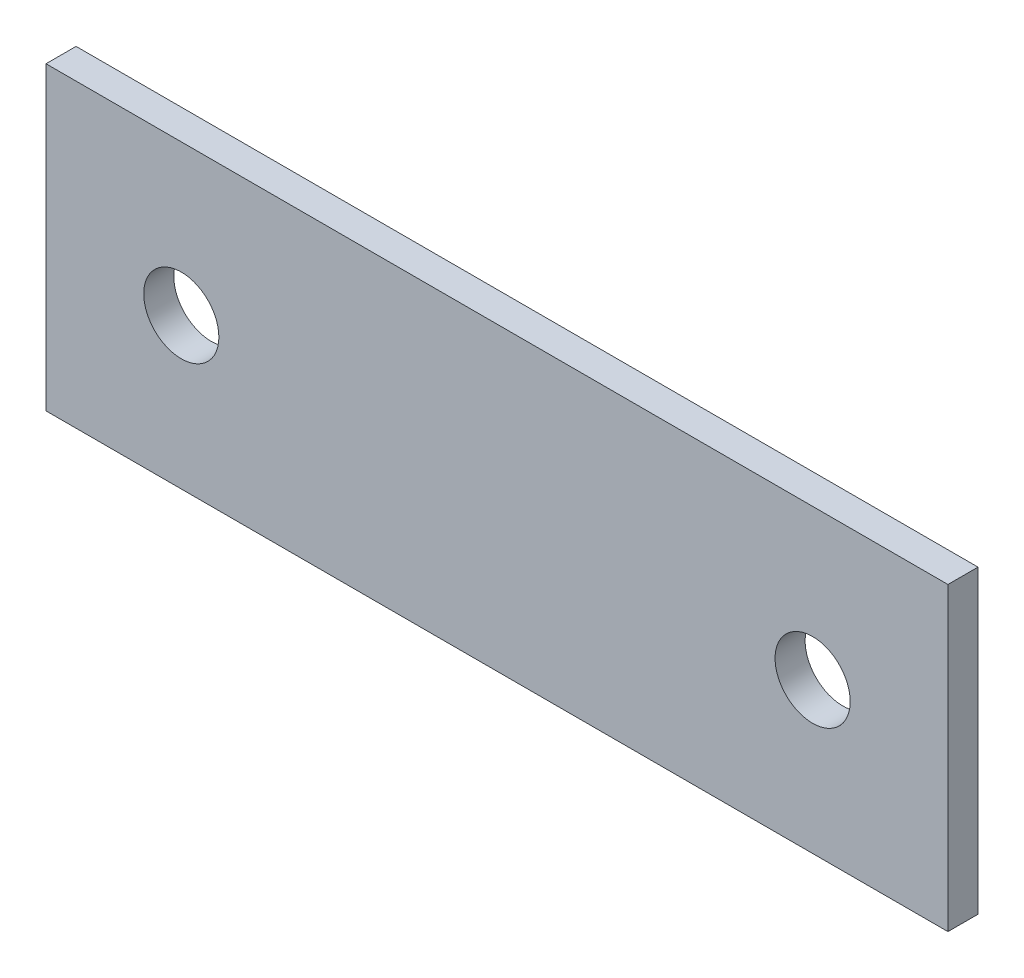
ISO-10303-21;
HEADER;
FILE_DESCRIPTION(('STEP AP214'),'2;1');
FILE_NAME('part.step','',(''),(''),'','','');
FILE_SCHEMA(('AUTOMOTIVE_DESIGN { 1 0 10303 214 1 1 1 1 }'));
ENDSEC;
DATA;
#1=APPLICATION_CONTEXT('core data for automotive mechanical design processes');
#2=APPLICATION_PROTOCOL_DEFINITION('international standard','automotive_design',2000,#1);
#3=PRODUCT_CONTEXT('',#1,'mechanical');
#4=PRODUCT('Part','Part','',(#3));
#5=PRODUCT_RELATED_PRODUCT_CATEGORY('part','',(#4));
#6=PRODUCT_DEFINITION_FORMATION('','',#4);
#7=PRODUCT_DEFINITION_CONTEXT('part definition',#1,'design');
#8=PRODUCT_DEFINITION('design','',#6,#7);
#9=PRODUCT_DEFINITION_SHAPE('','',#8);
#10=(LENGTH_UNIT() NAMED_UNIT(*) SI_UNIT(.MILLI.,.METRE.));
#11=(NAMED_UNIT(*) PLANE_ANGLE_UNIT() SI_UNIT($,.RADIAN.));
#12=(NAMED_UNIT(*) SI_UNIT($,.STERADIAN.) SOLID_ANGLE_UNIT());
#13=UNCERTAINTY_MEASURE_WITH_UNIT(LENGTH_MEASURE(1.E-05),#10,'distance_accuracy_value','');
#14=(GEOMETRIC_REPRESENTATION_CONTEXT(3) GLOBAL_UNCERTAINTY_ASSIGNED_CONTEXT((#13)) GLOBAL_UNIT_ASSIGNED_CONTEXT((#10,
#11,#12)) REPRESENTATION_CONTEXT('',''));
#15=CARTESIAN_POINT('',(0.,0.,0.));
#16=DIRECTION('',(0.,0.,1.));
#17=DIRECTION('',(1.,0.,0.));
#18=AXIS2_PLACEMENT_3D('',#15,#16,#17);
#19=CARTESIAN_POINT('',(0.,0.,2.));
#20=DIRECTION('',(0.,0.,-1.));
#21=DIRECTION('',(-1.,0.,0.));
#22=AXIS2_PLACEMENT_3D('',#19,#20,#21);
#23=PLANE('',#22);
#24=DIRECTION('',(0.,-1.,0.));
#25=VECTOR('',#24,1.);
#26=CARTESIAN_POINT('',(-30.,10.,2.));
#27=LINE('',#26,#25);
#28=CARTESIAN_POINT('',(-30.,10.,2.));
#29=VERTEX_POINT('',#28);
#30=CARTESIAN_POINT('',(-30.,-10.,2.));
#31=VERTEX_POINT('',#30);
#32=EDGE_CURVE('E88',#29,#31,#27,.T.);
#33=ORIENTED_EDGE('',*,*,#32,.T.);
#34=DIRECTION('',(1.,0.,0.));
#35=VECTOR('',#34,1.);
#36=CARTESIAN_POINT('',(30.,-10.,2.));
#37=LINE('',#36,#35);
#38=CARTESIAN_POINT('',(30.,-10.,2.));
#39=VERTEX_POINT('',#38);
#40=EDGE_CURVE('E83',#31,#39,#37,.T.);
#41=ORIENTED_EDGE('',*,*,#40,.T.);
#42=DIRECTION('',(0.,1.,0.));
#43=VECTOR('',#42,1.);
#44=CARTESIAN_POINT('',(30.,10.,2.));
#45=LINE('',#44,#43);
#46=CARTESIAN_POINT('',(30.,10.,2.));
#47=VERTEX_POINT('',#46);
#48=EDGE_CURVE('E86',#39,#47,#45,.T.);
#49=ORIENTED_EDGE('',*,*,#48,.T.);
#50=DIRECTION('',(-1.,0.,0.));
#51=VECTOR('',#50,1.);
#52=CARTESIAN_POINT('',(30.,10.,2.));
#53=LINE('',#52,#51);
#54=EDGE_CURVE('E53',#47,#29,#53,.T.);
#55=ORIENTED_EDGE('',*,*,#54,.T.);
#56=EDGE_LOOP('',(#33,#41,#49,#55));
#57=FACE_BOUND('',#56,.T.);
#58=CARTESIAN_POINT('',(-21.,0.,2.));
#59=DIRECTION('',(0.,0.,1.));
#60=DIRECTION('',(1.,0.,0.));
#61=AXIS2_PLACEMENT_3D('',#58,#59,#60);
#62=CIRCLE('',#61,2.5);
#63=CARTESIAN_POINT('',(-18.5,0.,2.));
#64=VERTEX_POINT('',#63);
#65=EDGE_CURVE('E103',#64,#64,#62,.T.);
#66=ORIENTED_EDGE('',*,*,#65,.F.);
#67=EDGE_LOOP('',(#66));
#68=FACE_BOUND('',#67,.T.);
#69=CARTESIAN_POINT('',(21.,0.,2.));
#70=DIRECTION('',(0.,0.,1.));
#71=DIRECTION('',(1.,0.,0.));
#72=AXIS2_PLACEMENT_3D('',#69,#70,#71);
#73=CIRCLE('',#72,2.5);
#74=CARTESIAN_POINT('',(23.5,0.,2.));
#75=VERTEX_POINT('',#74);
#76=EDGE_CURVE('E118',#75,#75,#73,.T.);
#77=ORIENTED_EDGE('',*,*,#76,.F.);
#78=EDGE_LOOP('',(#77));
#79=FACE_BOUND('',#78,.T.);
#80=ADVANCED_FACE('F36',(#57,#68,#79),#23,.F.);
#81=CARTESIAN_POINT('',(0.,0.,0.));
#82=DIRECTION('',(0.,0.,-1.));
#83=DIRECTION('',(-1.,0.,0.));
#84=AXIS2_PLACEMENT_3D('',#81,#82,#83);
#85=PLANE('',#84);
#86=CARTESIAN_POINT('',(-21.,0.,0.));
#87=DIRECTION('',(0.,0.,1.));
#88=DIRECTION('',(1.,0.,0.));
#89=AXIS2_PLACEMENT_3D('',#86,#87,#88);
#90=CIRCLE('',#89,2.5);
#91=CARTESIAN_POINT('',(-18.5,0.,0.));
#92=VERTEX_POINT('',#91);
#93=EDGE_CURVE('E115',#92,#92,#90,.T.);
#94=ORIENTED_EDGE('',*,*,#93,.T.);
#95=EDGE_LOOP('',(#94));
#96=FACE_BOUND('',#95,.T.);
#97=DIRECTION('',(0.,-1.,0.));
#98=VECTOR('',#97,1.);
#99=CARTESIAN_POINT('',(-30.,10.,0.));
#100=LINE('',#99,#98);
#101=CARTESIAN_POINT('',(-30.,10.,0.));
#102=VERTEX_POINT('',#101);
#103=CARTESIAN_POINT('',(-30.,-10.,0.));
#104=VERTEX_POINT('',#103);
#105=EDGE_CURVE('E100',#102,#104,#100,.T.);
#106=ORIENTED_EDGE('',*,*,#105,.F.);
#107=DIRECTION('',(-1.,0.,0.));
#108=VECTOR('',#107,1.);
#109=CARTESIAN_POINT('',(30.,10.,0.));
#110=LINE('',#109,#108);
#111=CARTESIAN_POINT('',(30.,10.,0.));
#112=VERTEX_POINT('',#111);
#113=EDGE_CURVE('E76',#112,#102,#110,.T.);
#114=ORIENTED_EDGE('',*,*,#113,.F.);
#115=DIRECTION('',(0.,1.,0.));
#116=VECTOR('',#115,1.);
#117=CARTESIAN_POINT('',(30.,10.,0.));
#118=LINE('',#117,#116);
#119=CARTESIAN_POINT('',(30.,-10.,0.));
#120=VERTEX_POINT('',#119);
#121=EDGE_CURVE('E70',#120,#112,#118,.T.);
#122=ORIENTED_EDGE('',*,*,#121,.F.);
#123=DIRECTION('',(1.,0.,0.));
#124=VECTOR('',#123,1.);
#125=CARTESIAN_POINT('',(30.,-10.,0.));
#126=LINE('',#125,#124);
#127=EDGE_CURVE('E92',#104,#120,#126,.T.);
#128=ORIENTED_EDGE('',*,*,#127,.F.);
#129=EDGE_LOOP('',(#106,#114,#122,#128));
#130=FACE_BOUND('',#129,.T.);
#131=CARTESIAN_POINT('',(21.,0.,0.));
#132=DIRECTION('',(0.,0.,1.));
#133=DIRECTION('',(1.,0.,0.));
#134=AXIS2_PLACEMENT_3D('',#131,#132,#133);
#135=CIRCLE('',#134,2.5);
#136=CARTESIAN_POINT('',(23.5,0.,0.));
#137=VERTEX_POINT('',#136);
#138=EDGE_CURVE('E121',#137,#137,#135,.T.);
#139=ORIENTED_EDGE('',*,*,#138,.T.);
#140=EDGE_LOOP('',(#139));
#141=FACE_BOUND('',#140,.T.);
#142=ADVANCED_FACE('F111',(#96,#130,#141),#85,.T.);
#143=CARTESIAN_POINT('',(-30.,10.,2.));
#144=DIRECTION('',(1.,0.,0.));
#145=DIRECTION('',(0.,0.,-1.));
#146=AXIS2_PLACEMENT_3D('',#143,#144,#145);
#147=PLANE('',#146);
#148=ORIENTED_EDGE('',*,*,#105,.T.);
#149=DIRECTION('',(0.,0.,-1.));
#150=VECTOR('',#149,1.);
#151=CARTESIAN_POINT('',(-30.,-10.,2.));
#152=LINE('',#151,#150);
#153=EDGE_CURVE('E11',#31,#104,#152,.T.);
#154=ORIENTED_EDGE('',*,*,#153,.F.);
#155=ORIENTED_EDGE('',*,*,#32,.F.);
#156=DIRECTION('',(0.,0.,-1.));
#157=VECTOR('',#156,1.);
#158=CARTESIAN_POINT('',(-30.,10.,2.));
#159=LINE('',#158,#157);
#160=EDGE_CURVE('E96',#29,#102,#159,.T.);
#161=ORIENTED_EDGE('',*,*,#160,.T.);
#162=EDGE_LOOP('',(#148,#154,#155,#161));
#163=FACE_BOUND('',#162,.T.);
#164=ADVANCED_FACE('F38',(#163),#147,.F.);
#165=CARTESIAN_POINT('',(30.,-10.,2.));
#166=DIRECTION('',(0.,1.,0.));
#167=DIRECTION('',(-1.,0.,0.));
#168=AXIS2_PLACEMENT_3D('',#165,#166,#167);
#169=PLANE('',#168);
#170=ORIENTED_EDGE('',*,*,#127,.T.);
#171=DIRECTION('',(0.,0.,-1.));
#172=VECTOR('',#171,1.);
#173=CARTESIAN_POINT('',(30.,-10.,2.));
#174=LINE('',#173,#172);
#175=EDGE_CURVE('E45',#39,#120,#174,.T.);
#176=ORIENTED_EDGE('',*,*,#175,.F.);
#177=ORIENTED_EDGE('',*,*,#40,.F.);
#178=ORIENTED_EDGE('',*,*,#153,.T.);
#179=EDGE_LOOP('',(#170,#176,#177,#178));
#180=FACE_BOUND('',#179,.T.);
#181=ADVANCED_FACE('F91',(#180),#169,.F.);
#182=CARTESIAN_POINT('',(30.,10.,2.));
#183=DIRECTION('',(-1.,0.,0.));
#184=DIRECTION('',(0.,0.,1.));
#185=AXIS2_PLACEMENT_3D('',#182,#183,#184);
#186=PLANE('',#185);
#187=ORIENTED_EDGE('',*,*,#121,.T.);
#188=DIRECTION('',(0.,0.,-1.));
#189=VECTOR('',#188,1.);
#190=CARTESIAN_POINT('',(30.,10.,2.));
#191=LINE('',#190,#189);
#192=EDGE_CURVE('E93',#47,#112,#191,.T.);
#193=ORIENTED_EDGE('',*,*,#192,.F.);
#194=ORIENTED_EDGE('',*,*,#48,.F.);
#195=ORIENTED_EDGE('',*,*,#175,.T.);
#196=EDGE_LOOP('',(#187,#193,#194,#195));
#197=FACE_BOUND('',#196,.T.);
#198=ADVANCED_FACE('F94',(#197),#186,.F.);
#199=CARTESIAN_POINT('',(30.,10.,2.));
#200=DIRECTION('',(0.,-1.,0.));
#201=DIRECTION('',(1.,0.,0.));
#202=AXIS2_PLACEMENT_3D('',#199,#200,#201);
#203=PLANE('',#202);
#204=ORIENTED_EDGE('',*,*,#113,.T.);
#205=ORIENTED_EDGE('',*,*,#160,.F.);
#206=ORIENTED_EDGE('',*,*,#54,.F.);
#207=ORIENTED_EDGE('',*,*,#192,.T.);
#208=EDGE_LOOP('',(#204,#205,#206,#207));
#209=FACE_BOUND('',#208,.T.);
#210=ADVANCED_FACE('F108',(#209),#203,.F.);
#211=CARTESIAN_POINT('',(-21.,0.,2.));
#212=DIRECTION('',(0.,0.,-1.));
#213=DIRECTION('',(-1.,0.,0.));
#214=AXIS2_PLACEMENT_3D('',#211,#212,#213);
#215=CYLINDRICAL_SURFACE('',#214,2.5);
#216=ORIENTED_EDGE('',*,*,#65,.T.);
#217=EDGE_LOOP('',(#216));
#218=FACE_BOUND('',#217,.T.);
#219=ORIENTED_EDGE('',*,*,#93,.F.);
#220=EDGE_LOOP('',(#219));
#221=FACE_BOUND('',#220,.T.);
#222=ADVANCED_FACE('F138',(#218,#221),#215,.F.);
#223=CARTESIAN_POINT('',(21.,0.,2.));
#224=DIRECTION('',(0.,0.,-1.));
#225=DIRECTION('',(-1.,0.,0.));
#226=AXIS2_PLACEMENT_3D('',#223,#224,#225);
#227=CYLINDRICAL_SURFACE('',#226,2.5);
#228=ORIENTED_EDGE('',*,*,#76,.T.);
#229=EDGE_LOOP('',(#228));
#230=FACE_BOUND('',#229,.T.);
#231=ORIENTED_EDGE('',*,*,#138,.F.);
#232=EDGE_LOOP('',(#231));
#233=FACE_BOUND('',#232,.T.);
#234=ADVANCED_FACE('F127',(#230,#233),#227,.F.);
#235=CLOSED_SHELL('',(#80,#142,#164,#181,#198,#210,#222,#234));
#236=MANIFOLD_SOLID_BREP('B2',#235);
#237=ADVANCED_BREP_SHAPE_REPRESENTATION('',(#18,#236),#14);
#238=SHAPE_DEFINITION_REPRESENTATION(#9,#237);
ENDSEC;
END-ISO-10303-21;
